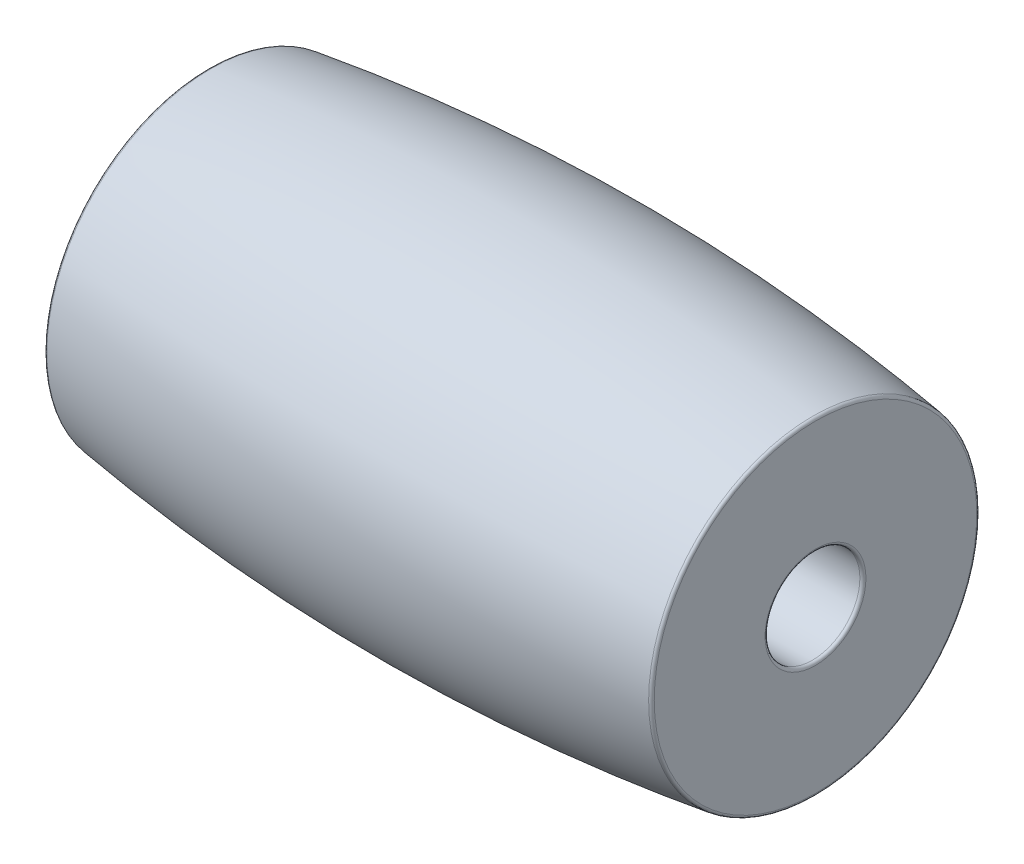
ISO-10303-21;
HEADER;
FILE_DESCRIPTION(('STEP AP214'),'2;1');
FILE_NAME('part.step','',(''),(''),'','','');
FILE_SCHEMA(('AUTOMOTIVE_DESIGN { 1 0 10303 214 1 1 1 1 }'));
ENDSEC;
DATA;
#1=APPLICATION_CONTEXT('core data for automotive mechanical design processes');
#2=APPLICATION_PROTOCOL_DEFINITION('international standard','automotive_design',2000,#1);
#3=PRODUCT_CONTEXT('',#1,'mechanical');
#4=PRODUCT('Part','Part','',(#3));
#5=PRODUCT_RELATED_PRODUCT_CATEGORY('part','',(#4));
#6=PRODUCT_DEFINITION_FORMATION('','',#4);
#7=PRODUCT_DEFINITION_CONTEXT('part definition',#1,'design');
#8=PRODUCT_DEFINITION('design','',#6,#7);
#9=PRODUCT_DEFINITION_SHAPE('','',#8);
#10=(LENGTH_UNIT() NAMED_UNIT(*) SI_UNIT(.MILLI.,.METRE.));
#11=(NAMED_UNIT(*) PLANE_ANGLE_UNIT() SI_UNIT($,.RADIAN.));
#12=(NAMED_UNIT(*) SI_UNIT($,.STERADIAN.) SOLID_ANGLE_UNIT());
#13=UNCERTAINTY_MEASURE_WITH_UNIT(LENGTH_MEASURE(1.E-05),#10,'distance_accuracy_value','');
#14=(GEOMETRIC_REPRESENTATION_CONTEXT(3) GLOBAL_UNCERTAINTY_ASSIGNED_CONTEXT((#13)) GLOBAL_UNIT_ASSIGNED_CONTEXT((#10,
#11,#12)) REPRESENTATION_CONTEXT('',''));
#15=CARTESIAN_POINT('',(0.,0.,0.));
#16=DIRECTION('',(0.,0.,1.));
#17=DIRECTION('',(1.,0.,0.));
#18=AXIS2_PLACEMENT_3D('',#15,#16,#17);
#19=CARTESIAN_POINT('',(-35.4832883800758,89.281,0.));
#20=DIRECTION('',(1.,0.,0.));
#21=DIRECTION('',(0.,0.,-1.));
#22=AXIS2_PLACEMENT_3D('',#19,#20,#21);
#23=CYLINDRICAL_SURFACE('',#22,3.3655);
#24=CARTESIAN_POINT('',(18.796,89.281,0.));
#25=DIRECTION('',(-1.,0.,0.));
#26=DIRECTION('',(0.,0.,1.));
#27=AXIS2_PLACEMENT_3D('',#24,#25,#26);
#28=CIRCLE('',#27,3.3655);
#29=CARTESIAN_POINT('',(18.796,89.281,3.3655));
#30=VERTEX_POINT('',#29);
#31=EDGE_CURVE('E446',#30,#30,#28,.T.);
#32=ORIENTED_EDGE('',*,*,#31,.F.);
#33=EDGE_LOOP('',(#32));
#34=FACE_BOUND('',#33,.T.);
#35=CARTESIAN_POINT('',(-18.796,89.281,0.));
#36=DIRECTION('',(1.,0.,0.));
#37=DIRECTION('',(0.,0.,-1.));
#38=AXIS2_PLACEMENT_3D('',#35,#36,#37);
#39=CIRCLE('',#38,3.3655);
#40=CARTESIAN_POINT('',(-18.796,89.281,-3.3655));
#41=VERTEX_POINT('',#40);
#42=EDGE_CURVE('E78',#41,#41,#39,.T.);
#43=ORIENTED_EDGE('',*,*,#42,.F.);
#44=EDGE_LOOP('',(#43));
#45=FACE_BOUND('',#44,.T.);
#46=ADVANCED_FACE('F17',(#34,#45),#23,.F.);
#47=CARTESIAN_POINT('',(18.796,89.281,0.));
#48=DIRECTION('',(-1.,0.,0.));
#49=DIRECTION('',(0.,0.,1.));
#50=AXIS2_PLACEMENT_3D('',#47,#48,#49);
#51=TOROIDAL_SURFACE('',#50,3.6195,0.254);
#52=CARTESIAN_POINT('',(19.05,89.281,0.));
#53=DIRECTION('',(1.,0.,0.));
#54=DIRECTION('',(0.,0.,1.));
#55=AXIS2_PLACEMENT_3D('',#52,#53,#54);
#56=CIRCLE('',#55,3.6195);
#57=CARTESIAN_POINT('',(19.05,89.281,3.6195));
#58=VERTEX_POINT('',#57);
#59=CARTESIAN_POINT('',(19.05,89.281,-3.6195));
#60=VERTEX_POINT('',#59);
#61=EDGE_CURVE('E73',#58,#60,#56,.T.);
#62=ORIENTED_EDGE('',*,*,#61,.T.);
#63=CARTESIAN_POINT('',(19.05,89.281,0.));
#64=DIRECTION('',(1.,0.,0.));
#65=DIRECTION('',(0.,0.,-1.));
#66=AXIS2_PLACEMENT_3D('',#63,#64,#65);
#67=CIRCLE('',#66,3.6195);
#68=EDGE_CURVE('E70',#60,#58,#67,.T.);
#69=ORIENTED_EDGE('',*,*,#68,.T.);
#70=EDGE_LOOP('',(#62,#69));
#71=FACE_BOUND('',#70,.T.);
#72=ORIENTED_EDGE('',*,*,#31,.T.);
#73=EDGE_LOOP('',(#72));
#74=FACE_BOUND('',#73,.T.);
#75=ADVANCED_FACE('F74',(#71,#74),#51,.T.);
#76=CARTESIAN_POINT('',(-18.796,89.281,0.));
#77=DIRECTION('',(1.,0.,0.));
#78=DIRECTION('',(0.,0.,-1.));
#79=AXIS2_PLACEMENT_3D('',#76,#77,#78);
#80=TOROIDAL_SURFACE('',#79,3.6195,0.254);
#81=CARTESIAN_POINT('',(-19.05,89.281,0.));
#82=DIRECTION('',(-1.,0.,0.));
#83=DIRECTION('',(0.,0.,-1.));
#84=AXIS2_PLACEMENT_3D('',#81,#82,#83);
#85=CIRCLE('',#84,3.6195);
#86=CARTESIAN_POINT('',(-19.05,89.281,-3.6195));
#87=VERTEX_POINT('',#86);
#88=CARTESIAN_POINT('',(-19.05,89.281,3.6195));
#89=VERTEX_POINT('',#88);
#90=EDGE_CURVE('E82',#87,#89,#85,.T.);
#91=ORIENTED_EDGE('',*,*,#90,.T.);
#92=CARTESIAN_POINT('',(-19.05,89.281,0.));
#93=DIRECTION('',(-1.,0.,0.));
#94=DIRECTION('',(0.,0.,1.));
#95=AXIS2_PLACEMENT_3D('',#92,#93,#94);
#96=CIRCLE('',#95,3.6195);
#97=EDGE_CURVE('E185',#89,#87,#96,.T.);
#98=ORIENTED_EDGE('',*,*,#97,.T.);
#99=EDGE_LOOP('',(#91,#98));
#100=FACE_BOUND('',#99,.T.);
#101=ORIENTED_EDGE('',*,*,#42,.T.);
#102=EDGE_LOOP('',(#101));
#103=FACE_BOUND('',#102,.T.);
#104=ADVANCED_FACE('F103',(#100,#103),#80,.T.);
#105=CARTESIAN_POINT('',(19.05,93.24975,0.));
#106=DIRECTION('',(-1.,0.,0.));
#107=DIRECTION('',(0.,0.,1.));
#108=AXIS2_PLACEMENT_3D('',#105,#106,#107);
#109=PLANE('',#108);
#110=CARTESIAN_POINT('',(19.05,89.281,0.));
#111=DIRECTION('',(1.,0.,0.));
#112=DIRECTION('',(0.,0.,-1.));
#113=AXIS2_PLACEMENT_3D('',#110,#111,#112);
#114=CIRCLE('',#113,3.96875);
#115=CARTESIAN_POINT('',(19.05,89.281,-3.96875));
#116=VERTEX_POINT('',#115);
#117=EDGE_CURVE('E193',#116,#116,#114,.T.);
#118=ORIENTED_EDGE('',*,*,#117,.T.);
#119=EDGE_LOOP('',(#118));
#120=FACE_BOUND('',#119,.T.);
#121=ORIENTED_EDGE('',*,*,#61,.F.);
#122=ORIENTED_EDGE('',*,*,#68,.F.);
#123=EDGE_LOOP('',(#121,#122));
#124=FACE_BOUND('',#123,.T.);
#125=ADVANCED_FACE('F81',(#120,#124),#109,.F.);
#126=CARTESIAN_POINT('',(-19.05,93.24975,0.));
#127=DIRECTION('',(1.,0.,0.));
#128=DIRECTION('',(0.,0.,-1.));
#129=AXIS2_PLACEMENT_3D('',#126,#127,#128);
#130=PLANE('',#129);
#131=CARTESIAN_POINT('',(-19.05,89.281,0.));
#132=DIRECTION('',(1.,0.,0.));
#133=DIRECTION('',(0.,0.,-1.));
#134=AXIS2_PLACEMENT_3D('',#131,#132,#133);
#135=CIRCLE('',#134,3.96875);
#136=CARTESIAN_POINT('',(-19.05,89.281,-3.96875));
#137=VERTEX_POINT('',#136);
#138=EDGE_CURVE('E173',#137,#137,#135,.F.);
#139=ORIENTED_EDGE('',*,*,#138,.T.);
#140=EDGE_LOOP('',(#139));
#141=FACE_BOUND('',#140,.T.);
#142=ORIENTED_EDGE('',*,*,#90,.F.);
#143=ORIENTED_EDGE('',*,*,#97,.F.);
#144=EDGE_LOOP('',(#142,#143));
#145=FACE_BOUND('',#144,.T.);
#146=ADVANCED_FACE('F102',(#141,#145),#130,.F.);
#147=CARTESIAN_POINT('',(-35.4832883800758,89.281,0.));
#148=DIRECTION('',(1.,0.,0.));
#149=DIRECTION('',(0.,0.,-1.));
#150=AXIS2_PLACEMENT_3D('',#147,#148,#149);
#151=CYLINDRICAL_SURFACE('',#150,3.96875);
#152=CARTESIAN_POINT('',(25.146,89.281,0.));
#153=DIRECTION('',(-1.,0.,0.));
#154=DIRECTION('',(0.,0.,1.));
#155=AXIS2_PLACEMENT_3D('',#152,#153,#154);
#156=CIRCLE('',#155,3.96875);
#157=CARTESIAN_POINT('',(25.146,89.281,3.96875));
#158=VERTEX_POINT('',#157);
#159=EDGE_CURVE('E170',#158,#158,#156,.T.);
#160=ORIENTED_EDGE('',*,*,#159,.F.);
#161=EDGE_LOOP('',(#160));
#162=FACE_BOUND('',#161,.T.);
#163=ORIENTED_EDGE('',*,*,#117,.F.);
#164=EDGE_LOOP('',(#163));
#165=FACE_BOUND('',#164,.T.);
#166=ADVANCED_FACE('F347',(#162,#165),#151,.F.);
#167=CARTESIAN_POINT('',(-35.4832883800758,89.281,0.));
#168=DIRECTION('',(1.,0.,0.));
#169=DIRECTION('',(0.,0.,-1.));
#170=AXIS2_PLACEMENT_3D('',#167,#168,#169);
#171=CYLINDRICAL_SURFACE('',#170,3.96875);
#172=ORIENTED_EDGE('',*,*,#138,.F.);
#173=EDGE_LOOP('',(#172));
#174=FACE_BOUND('',#173,.T.);
#175=CARTESIAN_POINT('',(-25.146,89.281,0.));
#176=DIRECTION('',(1.,0.,0.));
#177=DIRECTION('',(0.,0.,-1.));
#178=AXIS2_PLACEMENT_3D('',#175,#176,#177);
#179=CIRCLE('',#178,3.96875);
#180=CARTESIAN_POINT('',(-25.146,89.281,-3.96875));
#181=VERTEX_POINT('',#180);
#182=EDGE_CURVE('E161',#181,#181,#179,.T.);
#183=ORIENTED_EDGE('',*,*,#182,.F.);
#184=EDGE_LOOP('',(#183));
#185=FACE_BOUND('',#184,.T.);
#186=ADVANCED_FACE('F145',(#174,#185),#171,.F.);
#187=CARTESIAN_POINT('',(25.146,89.281,0.));
#188=DIRECTION('',(-1.,0.,0.));
#189=DIRECTION('',(0.,0.,1.));
#190=AXIS2_PLACEMENT_3D('',#187,#188,#189);
#191=TOROIDAL_SURFACE('',#190,4.22275,0.254);
#192=CARTESIAN_POINT('',(25.4,89.281,0.));
#193=DIRECTION('',(1.,0.,0.));
#194=DIRECTION('',(0.,0.,1.));
#195=AXIS2_PLACEMENT_3D('',#192,#193,#194);
#196=CIRCLE('',#195,4.22275);
#197=CARTESIAN_POINT('',(25.4,89.281,4.22275));
#198=VERTEX_POINT('',#197);
#199=CARTESIAN_POINT('',(25.4,89.281,-4.22275));
#200=VERTEX_POINT('',#199);
#201=EDGE_CURVE('E169',#198,#200,#196,.T.);
#202=ORIENTED_EDGE('',*,*,#201,.T.);
#203=CARTESIAN_POINT('',(25.4,89.281,0.));
#204=DIRECTION('',(1.,0.,0.));
#205=DIRECTION('',(0.,0.,-1.));
#206=AXIS2_PLACEMENT_3D('',#203,#204,#205);
#207=CIRCLE('',#206,4.22275);
#208=EDGE_CURVE('E156',#200,#198,#207,.T.);
#209=ORIENTED_EDGE('',*,*,#208,.T.);
#210=EDGE_LOOP('',(#202,#209));
#211=FACE_BOUND('',#210,.T.);
#212=ORIENTED_EDGE('',*,*,#159,.T.);
#213=EDGE_LOOP('',(#212));
#214=FACE_BOUND('',#213,.T.);
#215=ADVANCED_FACE('F133',(#211,#214),#191,.T.);
#216=CARTESIAN_POINT('',(-25.146,89.281,0.));
#217=DIRECTION('',(1.,0.,0.));
#218=DIRECTION('',(0.,0.,-1.));
#219=AXIS2_PLACEMENT_3D('',#216,#217,#218);
#220=TOROIDAL_SURFACE('',#219,4.22275,0.254);
#221=CARTESIAN_POINT('',(-25.4,89.281,0.));
#222=DIRECTION('',(-1.,0.,0.));
#223=DIRECTION('',(0.,0.,-1.));
#224=AXIS2_PLACEMENT_3D('',#221,#222,#223);
#225=CIRCLE('',#224,4.22275);
#226=CARTESIAN_POINT('',(-25.4,89.281,-4.22275));
#227=VERTEX_POINT('',#226);
#228=CARTESIAN_POINT('',(-25.4,89.281,4.22275));
#229=VERTEX_POINT('',#228);
#230=EDGE_CURVE('E236',#227,#229,#225,.T.);
#231=ORIENTED_EDGE('',*,*,#230,.T.);
#232=CARTESIAN_POINT('',(-25.4,89.281,0.));
#233=DIRECTION('',(-1.,0.,0.));
#234=DIRECTION('',(0.,0.,1.));
#235=AXIS2_PLACEMENT_3D('',#232,#233,#234);
#236=CIRCLE('',#235,4.22275);
#237=EDGE_CURVE('E246',#229,#227,#236,.T.);
#238=ORIENTED_EDGE('',*,*,#237,.T.);
#239=EDGE_LOOP('',(#231,#238));
#240=FACE_BOUND('',#239,.T.);
#241=ORIENTED_EDGE('',*,*,#182,.T.);
#242=EDGE_LOOP('',(#241));
#243=FACE_BOUND('',#242,.T.);
#244=ADVANCED_FACE('F144',(#240,#243),#220,.T.);
#245=CARTESIAN_POINT('',(25.4,102.997,0.));
#246=DIRECTION('',(-1.,0.,0.));
#247=DIRECTION('',(0.,0.,1.));
#248=AXIS2_PLACEMENT_3D('',#245,#246,#247);
#249=PLANE('',#248);
#250=CARTESIAN_POINT('',(25.4,89.281,0.));
#251=DIRECTION('',(-1.,0.,0.));
#252=DIRECTION('',(0.,0.,1.));
#253=AXIS2_PLACEMENT_3D('',#250,#251,#252);
#254=CIRCLE('',#253,13.495891893785);
#255=CARTESIAN_POINT('',(25.4,89.281,13.495891893785));
#256=VERTEX_POINT('',#255);
#257=CARTESIAN_POINT('',(25.4,89.281,-13.495891893785));
#258=VERTEX_POINT('',#257);
#259=EDGE_CURVE('E204',#256,#258,#254,.T.);
#260=ORIENTED_EDGE('',*,*,#259,.F.);
#261=CARTESIAN_POINT('',(25.4,89.281,0.));
#262=DIRECTION('',(-1.,0.,0.));
#263=DIRECTION('',(0.,0.,-1.));
#264=AXIS2_PLACEMENT_3D('',#261,#262,#263);
#265=CIRCLE('',#264,13.495891893785);
#266=EDGE_CURVE('E314',#258,#256,#265,.T.);
#267=ORIENTED_EDGE('',*,*,#266,.F.);
#268=EDGE_LOOP('',(#260,#267));
#269=FACE_BOUND('',#268,.T.);
#270=ORIENTED_EDGE('',*,*,#201,.F.);
#271=ORIENTED_EDGE('',*,*,#208,.F.);
#272=EDGE_LOOP('',(#270,#271));
#273=FACE_BOUND('',#272,.T.);
#274=ADVANCED_FACE('F289',(#269,#273),#249,.F.);
#275=CARTESIAN_POINT('',(-25.4,102.997,0.));
#276=DIRECTION('',(1.,0.,0.));
#277=DIRECTION('',(0.,0.,-1.));
#278=AXIS2_PLACEMENT_3D('',#275,#276,#277);
#279=PLANE('',#278);
#280=CARTESIAN_POINT('',(-25.4,89.281,0.));
#281=DIRECTION('',(1.,0.,0.));
#282=DIRECTION('',(0.,0.,-1.));
#283=AXIS2_PLACEMENT_3D('',#280,#281,#282);
#284=CIRCLE('',#283,13.495891893785);
#285=CARTESIAN_POINT('',(-25.4,89.281,-13.495891893785));
#286=VERTEX_POINT('',#285);
#287=CARTESIAN_POINT('',(-25.4,89.281,13.495891893785));
#288=VERTEX_POINT('',#287);
#289=EDGE_CURVE('E37',#286,#288,#284,.T.);
#290=ORIENTED_EDGE('',*,*,#289,.F.);
#291=CARTESIAN_POINT('',(-25.4,89.281,0.));
#292=DIRECTION('',(1.,0.,0.));
#293=DIRECTION('',(0.,0.,1.));
#294=AXIS2_PLACEMENT_3D('',#291,#292,#293);
#295=CIRCLE('',#294,13.495891893785);
#296=EDGE_CURVE('E264',#288,#286,#295,.T.);
#297=ORIENTED_EDGE('',*,*,#296,.F.);
#298=EDGE_LOOP('',(#290,#297));
#299=FACE_BOUND('',#298,.T.);
#300=ORIENTED_EDGE('',*,*,#230,.F.);
#301=ORIENTED_EDGE('',*,*,#237,.F.);
#302=EDGE_LOOP('',(#300,#301));
#303=FACE_BOUND('',#302,.T.);
#304=ADVANCED_FACE('F223',(#299,#303),#279,.F.);
#305=CARTESIAN_POINT('',(25.146,89.281,0.));
#306=DIRECTION('',(-1.,0.,0.));
#307=DIRECTION('',(0.,0.,1.));
#308=AXIS2_PLACEMENT_3D('',#305,#306,#307);
#309=TOROIDAL_SURFACE('',#308,13.495891893785,0.254);
#310=ORIENTED_EDGE('',*,*,#259,.T.);
#311=ORIENTED_EDGE('',*,*,#266,.T.);
#312=EDGE_LOOP('',(#310,#311));
#313=FACE_BOUND('',#312,.T.);
#314=CARTESIAN_POINT('',(25.181974248927,89.281,0.));
#315=DIRECTION('',(-1.,0.,0.));
#316=DIRECTION('',(0.,0.,1.));
#317=AXIS2_PLACEMENT_3D('',#314,#315,#316);
#318=CIRCLE('',#317,13.7473314559349);
#319=CARTESIAN_POINT('',(25.181974248927,89.281,13.7473314559349));
#320=VERTEX_POINT('',#319);
#321=EDGE_CURVE('E29',#320,#320,#318,.T.);
#322=ORIENTED_EDGE('',*,*,#321,.F.);
#323=EDGE_LOOP('',(#322));
#324=FACE_BOUND('',#323,.T.);
#325=ADVANCED_FACE('F211',(#313,#324),#309,.T.);
#326=CARTESIAN_POINT('',(-25.146,89.281,0.));
#327=DIRECTION('',(1.,0.,0.));
#328=DIRECTION('',(0.,0.,-1.));
#329=AXIS2_PLACEMENT_3D('',#326,#327,#328);
#330=TOROIDAL_SURFACE('',#329,13.495891893785,0.254);
#331=CARTESIAN_POINT('',(-25.181974248927,89.281,0.));
#332=DIRECTION('',(1.,0.,0.));
#333=DIRECTION('',(0.,0.,-1.));
#334=AXIS2_PLACEMENT_3D('',#331,#332,#333);
#335=CIRCLE('',#334,13.7473314559349);
#336=CARTESIAN_POINT('',(-25.181974248927,89.281,-13.7473314559349));
#337=VERTEX_POINT('',#336);
#338=EDGE_CURVE('E11',#337,#337,#335,.T.);
#339=ORIENTED_EDGE('',*,*,#338,.F.);
#340=EDGE_LOOP('',(#339));
#341=FACE_BOUND('',#340,.T.);
#342=ORIENTED_EDGE('',*,*,#296,.T.);
#343=ORIENTED_EDGE('',*,*,#289,.T.);
#344=EDGE_LOOP('',(#342,#343));
#345=FACE_BOUND('',#344,.T.);
#346=ADVANCED_FACE('F222',(#341,#345),#330,.T.);
#347=CARTESIAN_POINT('',(0.,89.281,0.));
#348=DIRECTION('',(-1.,0.,0.));
#349=DIRECTION('',(0.,0.,1.));
#350=AXIS2_PLACEMENT_3D('',#347,#348,#349);
#351=DEGENERATE_TOROIDAL_SURFACE('',#350,162.260362048999,177.800000000001,.F.);
#352=ORIENTED_EDGE('',*,*,#321,.T.);
#353=EDGE_LOOP('',(#352));
#354=FACE_BOUND('',#353,.T.);
#355=ORIENTED_EDGE('',*,*,#338,.T.);
#356=EDGE_LOOP('',(#355));
#357=FACE_BOUND('',#356,.T.);
#358=ADVANCED_FACE('F19',(#354,#357),#351,.F.);
#359=CLOSED_SHELL('',(#46,#75,#104,#125,#146,#166,#186,#215,#244,#274,#304,#325,#346,#358));
#360=MANIFOLD_SOLID_BREP('B1',#359);
#361=ADVANCED_BREP_SHAPE_REPRESENTATION('',(#18,#360),#14);
#362=SHAPE_DEFINITION_REPRESENTATION(#9,#361);
ENDSEC;
END-ISO-10303-21;
